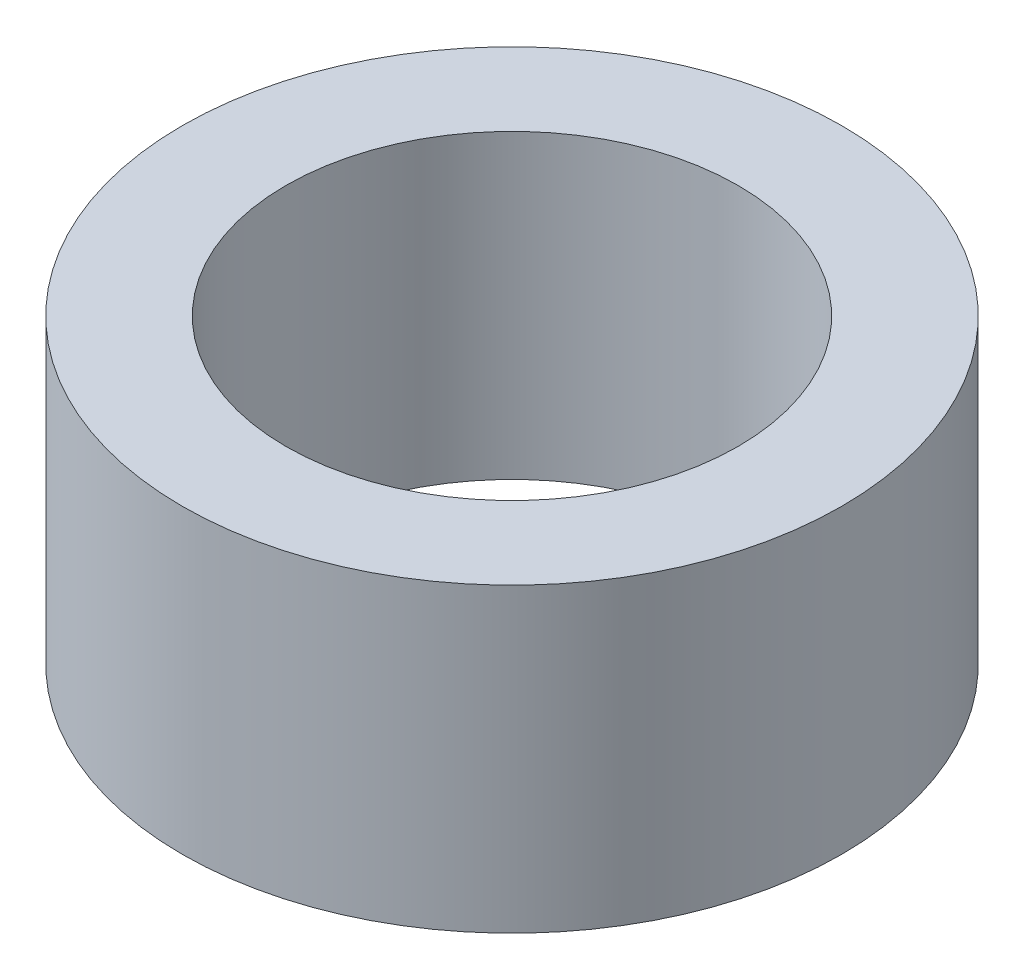
ISO-10303-21;
HEADER;
FILE_DESCRIPTION(('STEP AP214'),'2;1');
FILE_NAME('part.step','',(''),(''),'','','');
FILE_SCHEMA(('AUTOMOTIVE_DESIGN { 1 0 10303 214 1 1 1 1 }'));
ENDSEC;
DATA;
#1=APPLICATION_CONTEXT('core data for automotive mechanical design processes');
#2=APPLICATION_PROTOCOL_DEFINITION('international standard','automotive_design',2000,#1);
#3=PRODUCT_CONTEXT('',#1,'mechanical');
#4=PRODUCT('Part','Part','',(#3));
#5=PRODUCT_RELATED_PRODUCT_CATEGORY('part','',(#4));
#6=PRODUCT_DEFINITION_FORMATION('','',#4);
#7=PRODUCT_DEFINITION_CONTEXT('part definition',#1,'design');
#8=PRODUCT_DEFINITION('design','',#6,#7);
#9=PRODUCT_DEFINITION_SHAPE('','',#8);
#10=(LENGTH_UNIT() NAMED_UNIT(*) SI_UNIT(.MILLI.,.METRE.));
#11=(NAMED_UNIT(*) PLANE_ANGLE_UNIT() SI_UNIT($,.RADIAN.));
#12=(NAMED_UNIT(*) SI_UNIT($,.STERADIAN.) SOLID_ANGLE_UNIT());
#13=UNCERTAINTY_MEASURE_WITH_UNIT(LENGTH_MEASURE(1.E-05),#10,'distance_accuracy_value','');
#14=(GEOMETRIC_REPRESENTATION_CONTEXT(3) GLOBAL_UNCERTAINTY_ASSIGNED_CONTEXT((#13)) GLOBAL_UNIT_ASSIGNED_CONTEXT((#10,
#11,#12)) REPRESENTATION_CONTEXT('',''));
#15=CARTESIAN_POINT('',(0.,0.,0.));
#16=DIRECTION('',(0.,0.,1.));
#17=DIRECTION('',(1.,0.,0.));
#18=AXIS2_PLACEMENT_3D('',#15,#16,#17);
#19=CARTESIAN_POINT('',(0.,10.16,0.));
#20=DIRECTION('',(0.,-1.,0.));
#21=DIRECTION('',(0.,0.,-1.));
#22=AXIS2_PLACEMENT_3D('',#19,#20,#21);
#23=CYLINDRICAL_SURFACE('',#22,11.1125);
#24=CARTESIAN_POINT('',(0.,10.16,0.));
#25=DIRECTION('',(0.,1.,0.));
#26=DIRECTION('',(0.,0.,1.));
#27=AXIS2_PLACEMENT_3D('',#24,#25,#26);
#28=CIRCLE('',#27,11.1125);
#29=CARTESIAN_POINT('',(0.,10.16,11.1125));
#30=VERTEX_POINT('',#29);
#31=EDGE_CURVE('E10',#30,#30,#28,.T.);
#32=ORIENTED_EDGE('',*,*,#31,.F.);
#33=EDGE_LOOP('',(#32));
#34=FACE_BOUND('',#33,.T.);
#35=CARTESIAN_POINT('',(0.,0.,0.));
#36=DIRECTION('',(0.,1.,0.));
#37=DIRECTION('',(0.,0.,1.));
#38=AXIS2_PLACEMENT_3D('',#35,#36,#37);
#39=CIRCLE('',#38,11.1125);
#40=CARTESIAN_POINT('',(0.,0.,11.1125));
#41=VERTEX_POINT('',#40);
#42=EDGE_CURVE('E33',#41,#41,#39,.T.);
#43=ORIENTED_EDGE('',*,*,#42,.T.);
#44=EDGE_LOOP('',(#43));
#45=FACE_BOUND('',#44,.T.);
#46=ADVANCED_FACE('F30',(#34,#45),#23,.T.);
#47=CARTESIAN_POINT('',(0.,10.16,0.));
#48=DIRECTION('',(0.,1.,0.));
#49=DIRECTION('',(0.,0.,1.));
#50=AXIS2_PLACEMENT_3D('',#47,#48,#49);
#51=PLANE('',#50);
#52=CARTESIAN_POINT('',(0.,10.16,0.));
#53=DIRECTION('',(0.,1.,0.));
#54=DIRECTION('',(0.,0.,1.));
#55=AXIS2_PLACEMENT_3D('',#52,#53,#54);
#56=CIRCLE('',#55,7.62);
#57=CARTESIAN_POINT('',(0.,10.16,7.62));
#58=VERTEX_POINT('',#57);
#59=EDGE_CURVE('E42',#58,#58,#56,.T.);
#60=ORIENTED_EDGE('',*,*,#59,.F.);
#61=EDGE_LOOP('',(#60));
#62=FACE_BOUND('',#61,.T.);
#63=ORIENTED_EDGE('',*,*,#31,.T.);
#64=EDGE_LOOP('',(#63));
#65=FACE_BOUND('',#64,.T.);
#66=ADVANCED_FACE('F57',(#62,#65),#51,.T.);
#67=CARTESIAN_POINT('',(0.,0.,0.));
#68=DIRECTION('',(0.,1.,0.));
#69=DIRECTION('',(0.,0.,1.));
#70=AXIS2_PLACEMENT_3D('',#67,#68,#69);
#71=PLANE('',#70);
#72=CARTESIAN_POINT('',(0.,0.,0.));
#73=DIRECTION('',(0.,1.,0.));
#74=DIRECTION('',(0.,0.,1.));
#75=AXIS2_PLACEMENT_3D('',#72,#73,#74);
#76=CIRCLE('',#75,7.62);
#77=CARTESIAN_POINT('',(0.,0.,7.62));
#78=VERTEX_POINT('',#77);
#79=EDGE_CURVE('E40',#78,#78,#76,.T.);
#80=ORIENTED_EDGE('',*,*,#79,.T.);
#81=EDGE_LOOP('',(#80));
#82=FACE_BOUND('',#81,.T.);
#83=ORIENTED_EDGE('',*,*,#42,.F.);
#84=EDGE_LOOP('',(#83));
#85=FACE_BOUND('',#84,.T.);
#86=ADVANCED_FACE('F48',(#82,#85),#71,.F.);
#87=CARTESIAN_POINT('',(0.,0.,0.));
#88=DIRECTION('',(0.,1.,0.));
#89=DIRECTION('',(0.,0.,1.));
#90=AXIS2_PLACEMENT_3D('',#87,#88,#89);
#91=CYLINDRICAL_SURFACE('',#90,7.62);
#92=ORIENTED_EDGE('',*,*,#79,.F.);
#93=EDGE_LOOP('',(#92));
#94=FACE_BOUND('',#93,.T.);
#95=ORIENTED_EDGE('',*,*,#59,.T.);
#96=EDGE_LOOP('',(#95));
#97=FACE_BOUND('',#96,.T.);
#98=ADVANCED_FACE('F51',(#94,#97),#91,.F.);
#99=CLOSED_SHELL('',(#46,#66,#86,#98));
#100=MANIFOLD_SOLID_BREP('B2',#99);
#101=ADVANCED_BREP_SHAPE_REPRESENTATION('',(#18,#100),#14);
#102=SHAPE_DEFINITION_REPRESENTATION(#9,#101);
ENDSEC;
END-ISO-10303-21;
